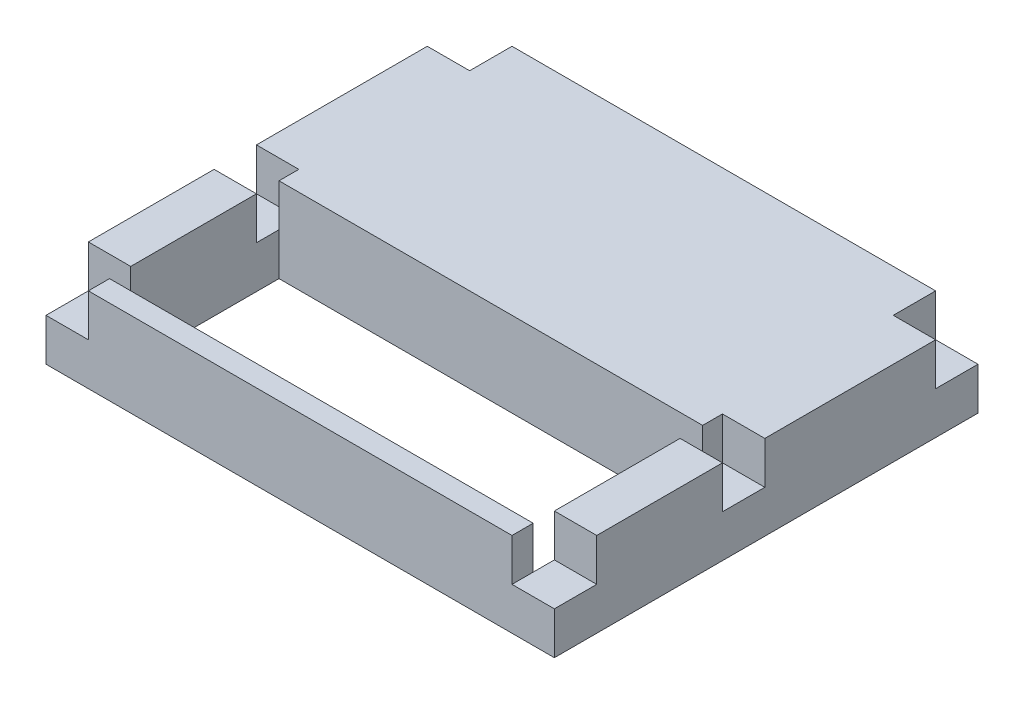
ISO-10303-21;
HEADER;
FILE_DESCRIPTION(('STEP AP214'),'2;1');
FILE_NAME('part.step','',(''),(''),'','','');
FILE_SCHEMA(('AUTOMOTIVE_DESIGN { 1 0 10303 214 1 1 1 1 }'));
ENDSEC;
DATA;
#1=APPLICATION_CONTEXT('core data for automotive mechanical design processes');
#2=APPLICATION_PROTOCOL_DEFINITION('international standard','automotive_design',2000,#1);
#3=PRODUCT_CONTEXT('',#1,'mechanical');
#4=PRODUCT('Part','Part','',(#3));
#5=PRODUCT_RELATED_PRODUCT_CATEGORY('part','',(#4));
#6=PRODUCT_DEFINITION_FORMATION('','',#4);
#7=PRODUCT_DEFINITION_CONTEXT('part definition',#1,'design');
#8=PRODUCT_DEFINITION('design','',#6,#7);
#9=PRODUCT_DEFINITION_SHAPE('','',#8);
#10=(LENGTH_UNIT() NAMED_UNIT(*) SI_UNIT(.MILLI.,.METRE.));
#11=(NAMED_UNIT(*) PLANE_ANGLE_UNIT() SI_UNIT($,.RADIAN.));
#12=(NAMED_UNIT(*) SI_UNIT($,.STERADIAN.) SOLID_ANGLE_UNIT());
#13=UNCERTAINTY_MEASURE_WITH_UNIT(LENGTH_MEASURE(1.E-05),#10,'distance_accuracy_value','');
#14=(GEOMETRIC_REPRESENTATION_CONTEXT(3) GLOBAL_UNCERTAINTY_ASSIGNED_CONTEXT((#13)) GLOBAL_UNIT_ASSIGNED_CONTEXT((#10,
#11,#12)) REPRESENTATION_CONTEXT('',''));
#15=CARTESIAN_POINT('',(0.,0.,0.));
#16=DIRECTION('',(0.,0.,1.));
#17=DIRECTION('',(1.,0.,0.));
#18=AXIS2_PLACEMENT_3D('',#15,#16,#17);
#19=CARTESIAN_POINT('',(0.,20.,0.));
#20=DIRECTION('',(0.,1.,0.));
#21=DIRECTION('',(0.,0.,1.));
#22=AXIS2_PLACEMENT_3D('',#19,#20,#21);
#23=PLANE('',#22);
#24=DIRECTION('',(-1.,0.,0.));
#25=VECTOR('',#24,1.);
#26=CARTESIAN_POINT('',(-60.,20.,40.));
#27=LINE('',#26,#25);
#28=CARTESIAN_POINT('',(-50.,20.,40.));
#29=VERTEX_POINT('',#28);
#30=CARTESIAN_POINT('',(-60.,20.,40.));
#31=VERTEX_POINT('',#30);
#32=EDGE_CURVE('E294',#29,#31,#27,.T.);
#33=ORIENTED_EDGE('',*,*,#32,.F.);
#34=DIRECTION('',(0.,0.,-1.));
#35=VECTOR('',#34,1.);
#36=CARTESIAN_POINT('',(-50.,20.,0.));
#37=LINE('',#36,#35);
#38=CARTESIAN_POINT('',(-50.,20.,10.3208888623795));
#39=VERTEX_POINT('',#38);
#40=EDGE_CURVE('E404',#29,#39,#37,.T.);
#41=ORIENTED_EDGE('',*,*,#40,.T.);
#42=DIRECTION('',(-1.,0.,0.));
#43=VECTOR('',#42,1.);
#44=CARTESIAN_POINT('',(0.,20.,10.3208888623795));
#45=LINE('',#44,#43);
#46=CARTESIAN_POINT('',(-60.,20.,10.3208888623795));
#47=VERTEX_POINT('',#46);
#48=EDGE_CURVE('E346',#39,#47,#45,.T.);
#49=ORIENTED_EDGE('',*,*,#48,.T.);
#50=DIRECTION('',(0.,0.,1.));
#51=VECTOR('',#50,1.);
#52=CARTESIAN_POINT('',(-60.,20.,-50.));
#53=LINE('',#52,#51);
#54=EDGE_CURVE('E432',#47,#31,#53,.T.);
#55=ORIENTED_EDGE('',*,*,#54,.T.);
#56=EDGE_LOOP('',(#33,#41,#49,#55));
#57=FACE_BOUND('',#56,.T.);
#58=ADVANCED_FACE('F39',(#57),#23,.T.);
#59=DIRECTION('',(0.,0.,-1.));
#60=VECTOR('',#59,1.);
#61=CARTESIAN_POINT('',(-50.,20.,40.));
#62=LINE('',#61,#60);
#63=CARTESIAN_POINT('',(-50.,20.,50.));
#64=VERTEX_POINT('',#63);
#65=CARTESIAN_POINT('',(-50.,20.,45.));
#66=VERTEX_POINT('',#65);
#67=EDGE_CURVE('E304',#64,#66,#62,.T.);
#68=ORIENTED_EDGE('',*,*,#67,.F.);
#69=DIRECTION('',(1.,0.,0.));
#70=VECTOR('',#69,1.);
#71=CARTESIAN_POINT('',(-60.,20.,50.));
#72=LINE('',#71,#70);
#73=CARTESIAN_POINT('',(50.,20.,50.));
#74=VERTEX_POINT('',#73);
#75=EDGE_CURVE('E435',#64,#74,#72,.T.);
#76=ORIENTED_EDGE('',*,*,#75,.T.);
#77=DIRECTION('',(0.,0.,1.));
#78=VECTOR('',#77,1.);
#79=CARTESIAN_POINT('',(50.,20.,50.));
#80=LINE('',#79,#78);
#81=CARTESIAN_POINT('',(50.,20.,45.));
#82=VERTEX_POINT('',#81);
#83=EDGE_CURVE('E269',#82,#74,#80,.T.);
#84=ORIENTED_EDGE('',*,*,#83,.F.);
#85=DIRECTION('',(1.,0.,0.));
#86=VECTOR('',#85,1.);
#87=CARTESIAN_POINT('',(-55.,20.,45.));
#88=LINE('',#87,#86);
#89=EDGE_CURVE('E416',#66,#82,#88,.T.);
#90=ORIENTED_EDGE('',*,*,#89,.F.);
#91=EDGE_LOOP('',(#68,#76,#84,#90));
#92=FACE_BOUND('',#91,.T.);
#93=ADVANCED_FACE('F504',(#92),#23,.T.);
#94=DIRECTION('',(-1.,0.,0.));
#95=VECTOR('',#94,1.);
#96=CARTESIAN_POINT('',(50.,20.,40.));
#97=LINE('',#96,#95);
#98=CARTESIAN_POINT('',(60.,20.,40.));
#99=VERTEX_POINT('',#98);
#100=CARTESIAN_POINT('',(50.,20.,40.));
#101=VERTEX_POINT('',#100);
#102=EDGE_CURVE('E278',#99,#101,#97,.T.);
#103=ORIENTED_EDGE('',*,*,#102,.F.);
#104=DIRECTION('',(0.,0.,-1.));
#105=VECTOR('',#104,1.);
#106=CARTESIAN_POINT('',(60.,20.,-50.));
#107=LINE('',#106,#105);
#108=CARTESIAN_POINT('',(60.,20.,10.3208888623795));
#109=VERTEX_POINT('',#108);
#110=EDGE_CURVE('E428',#99,#109,#107,.T.);
#111=ORIENTED_EDGE('',*,*,#110,.T.);
#112=DIRECTION('',(1.,0.,0.));
#113=VECTOR('',#112,1.);
#114=CARTESIAN_POINT('',(0.,20.,10.3208888623795));
#115=LINE('',#114,#113);
#116=CARTESIAN_POINT('',(50.,20.,10.3208888623795));
#117=VERTEX_POINT('',#116);
#118=EDGE_CURVE('E378',#117,#109,#115,.T.);
#119=ORIENTED_EDGE('',*,*,#118,.F.);
#120=DIRECTION('',(0.,0.,-1.));
#121=VECTOR('',#120,1.);
#122=CARTESIAN_POINT('',(50.,20.,0.));
#123=LINE('',#122,#121);
#124=EDGE_CURVE('E391',#101,#117,#123,.T.);
#125=ORIENTED_EDGE('',*,*,#124,.F.);
#126=EDGE_LOOP('',(#103,#111,#119,#125));
#127=FACE_BOUND('',#126,.T.);
#128=ADVANCED_FACE('F510',(#127),#23,.T.);
#129=CARTESIAN_POINT('',(60.,20.,-50.));
#130=DIRECTION('',(-1.,0.,0.));
#131=DIRECTION('',(0.,0.,1.));
#132=AXIS2_PLACEMENT_3D('',#129,#130,#131);
#133=PLANE('',#132);
#134=ORIENTED_EDGE('',*,*,#110,.F.);
#135=DIRECTION('',(0.,1.,0.));
#136=VECTOR('',#135,1.);
#137=CARTESIAN_POINT('',(60.,10.,40.));
#138=LINE('',#137,#136);
#139=CARTESIAN_POINT('',(60.,10.,40.));
#140=VERTEX_POINT('',#139);
#141=EDGE_CURVE('E277',#140,#99,#138,.T.);
#142=ORIENTED_EDGE('',*,*,#141,.F.);
#143=DIRECTION('',(0.,0.,-1.));
#144=VECTOR('',#143,1.);
#145=CARTESIAN_POINT('',(60.,10.,40.));
#146=LINE('',#145,#144);
#147=CARTESIAN_POINT('',(60.,10.,50.));
#148=VERTEX_POINT('',#147);
#149=EDGE_CURVE('E265',#148,#140,#146,.T.);
#150=ORIENTED_EDGE('',*,*,#149,.F.);
#151=DIRECTION('',(0.,-1.,0.));
#152=VECTOR('',#151,1.);
#153=CARTESIAN_POINT('',(60.,20.,50.));
#154=LINE('',#153,#152);
#155=CARTESIAN_POINT('',(60.,0.,50.));
#156=VERTEX_POINT('',#155);
#157=EDGE_CURVE('E438',#148,#156,#154,.T.);
#158=ORIENTED_EDGE('',*,*,#157,.T.);
#159=DIRECTION('',(0.,0.,-1.));
#160=VECTOR('',#159,1.);
#161=CARTESIAN_POINT('',(60.,0.,-50.));
#162=LINE('',#161,#160);
#163=CARTESIAN_POINT('',(60.,0.,-50.));
#164=VERTEX_POINT('',#163);
#165=EDGE_CURVE('E423',#156,#164,#162,.T.);
#166=ORIENTED_EDGE('',*,*,#165,.T.);
#167=DIRECTION('',(0.,-1.,0.));
#168=VECTOR('',#167,1.);
#169=CARTESIAN_POINT('',(60.,20.,-50.));
#170=LINE('',#169,#168);
#171=CARTESIAN_POINT('',(60.,10.,-50.));
#172=VERTEX_POINT('',#171);
#173=EDGE_CURVE('E47',#172,#164,#170,.T.);
#174=ORIENTED_EDGE('',*,*,#173,.F.);
#175=DIRECTION('',(0.,0.,-1.));
#176=VECTOR('',#175,1.);
#177=CARTESIAN_POINT('',(60.,10.,-50.));
#178=LINE('',#177,#176);
#179=CARTESIAN_POINT('',(60.,10.,-40.));
#180=VERTEX_POINT('',#179);
#181=EDGE_CURVE('E62',#180,#172,#178,.T.);
#182=ORIENTED_EDGE('',*,*,#181,.F.);
#183=DIRECTION('',(0.,1.,0.));
#184=VECTOR('',#183,1.);
#185=CARTESIAN_POINT('',(60.,10.,-40.));
#186=LINE('',#185,#184);
#187=CARTESIAN_POINT('',(60.,20.,-40.));
#188=VERTEX_POINT('',#187);
#189=EDGE_CURVE('E260',#180,#188,#186,.T.);
#190=ORIENTED_EDGE('',*,*,#189,.T.);
#191=CARTESIAN_POINT('',(60.,20.,0.320888862379548));
#192=VERTEX_POINT('',#191);
#193=EDGE_CURVE('E430',#192,#188,#107,.T.);
#194=ORIENTED_EDGE('',*,*,#193,.F.);
#195=DIRECTION('',(0.,1.,0.));
#196=VECTOR('',#195,1.);
#197=CARTESIAN_POINT('',(60.,10.,0.320888862379548));
#198=LINE('',#197,#196);
#199=CARTESIAN_POINT('',(60.,10.,0.320888862379548));
#200=VERTEX_POINT('',#199);
#201=EDGE_CURVE('E384',#200,#192,#198,.T.);
#202=ORIENTED_EDGE('',*,*,#201,.F.);
#203=DIRECTION('',(0.,0.,-1.));
#204=VECTOR('',#203,1.);
#205=CARTESIAN_POINT('',(60.,10.,0.));
#206=LINE('',#205,#204);
#207=CARTESIAN_POINT('',(60.,10.,10.3208888623795));
#208=VERTEX_POINT('',#207);
#209=EDGE_CURVE('E371',#208,#200,#206,.T.);
#210=ORIENTED_EDGE('',*,*,#209,.F.);
#211=DIRECTION('',(0.,1.,0.));
#212=VECTOR('',#211,1.);
#213=CARTESIAN_POINT('',(60.,10.,10.3208888623795));
#214=LINE('',#213,#212);
#215=EDGE_CURVE('E386',#208,#109,#214,.T.);
#216=ORIENTED_EDGE('',*,*,#215,.T.);
#217=EDGE_LOOP('',(#134,#142,#150,#158,#166,#174,#182,#190,#194,#202,#210,#216));
#218=FACE_BOUND('',#217,.T.);
#219=ADVANCED_FACE('F41',(#218),#133,.F.);
#220=CARTESIAN_POINT('',(-60.,20.,-50.));
#221=DIRECTION('',(1.,0.,0.));
#222=DIRECTION('',(0.,0.,-1.));
#223=AXIS2_PLACEMENT_3D('',#220,#221,#222);
#224=PLANE('',#223);
#225=DIRECTION('',(0.,0.,1.));
#226=VECTOR('',#225,1.);
#227=CARTESIAN_POINT('',(-60.,10.,50.));
#228=LINE('',#227,#226);
#229=CARTESIAN_POINT('',(-60.,10.,40.));
#230=VERTEX_POINT('',#229);
#231=CARTESIAN_POINT('',(-60.,10.,50.));
#232=VERTEX_POINT('',#231);
#233=EDGE_CURVE('E301',#230,#232,#228,.T.);
#234=ORIENTED_EDGE('',*,*,#233,.F.);
#235=DIRECTION('',(0.,1.,0.));
#236=VECTOR('',#235,1.);
#237=CARTESIAN_POINT('',(-60.,10.,40.));
#238=LINE('',#237,#236);
#239=EDGE_CURVE('E280',#230,#31,#238,.T.);
#240=ORIENTED_EDGE('',*,*,#239,.T.);
#241=ORIENTED_EDGE('',*,*,#54,.F.);
#242=DIRECTION('',(0.,1.,0.));
#243=VECTOR('',#242,1.);
#244=CARTESIAN_POINT('',(-60.,10.,10.3208888623795));
#245=LINE('',#244,#243);
#246=CARTESIAN_POINT('',(-60.,10.,10.3208888623795));
#247=VERTEX_POINT('',#246);
#248=EDGE_CURVE('E354',#247,#47,#245,.T.);
#249=ORIENTED_EDGE('',*,*,#248,.F.);
#250=DIRECTION('',(0.,0.,1.));
#251=VECTOR('',#250,1.);
#252=CARTESIAN_POINT('',(-60.,10.,0.));
#253=LINE('',#252,#251);
#254=CARTESIAN_POINT('',(-60.,10.,0.320888862379548));
#255=VERTEX_POINT('',#254);
#256=EDGE_CURVE('E342',#255,#247,#253,.T.);
#257=ORIENTED_EDGE('',*,*,#256,.F.);
#258=DIRECTION('',(0.,1.,0.));
#259=VECTOR('',#258,1.);
#260=CARTESIAN_POINT('',(-60.,10.,0.320888862379548));
#261=LINE('',#260,#259);
#262=CARTESIAN_POINT('',(-60.,20.,0.320888862379548));
#263=VERTEX_POINT('',#262);
#264=EDGE_CURVE('E357',#255,#263,#261,.T.);
#265=ORIENTED_EDGE('',*,*,#264,.T.);
#266=CARTESIAN_POINT('',(-60.,20.,-40.));
#267=VERTEX_POINT('',#266);
#268=EDGE_CURVE('E433',#267,#263,#53,.T.);
#269=ORIENTED_EDGE('',*,*,#268,.F.);
#270=DIRECTION('',(0.,1.,0.));
#271=VECTOR('',#270,1.);
#272=CARTESIAN_POINT('',(-60.,10.,-40.));
#273=LINE('',#272,#271);
#274=CARTESIAN_POINT('',(-60.,10.,-40.));
#275=VERTEX_POINT('',#274);
#276=EDGE_CURVE('E321',#275,#267,#273,.T.);
#277=ORIENTED_EDGE('',*,*,#276,.F.);
#278=DIRECTION('',(0.,0.,1.));
#279=VECTOR('',#278,1.);
#280=CARTESIAN_POINT('',(-60.,10.,-40.));
#281=LINE('',#280,#279);
#282=CARTESIAN_POINT('',(-60.,10.,-50.));
#283=VERTEX_POINT('',#282);
#284=EDGE_CURVE('E312',#283,#275,#281,.T.);
#285=ORIENTED_EDGE('',*,*,#284,.F.);
#286=DIRECTION('',(0.,-1.,0.));
#287=VECTOR('',#286,1.);
#288=CARTESIAN_POINT('',(-60.,20.,-50.));
#289=LINE('',#288,#287);
#290=CARTESIAN_POINT('',(-60.,0.,-50.));
#291=VERTEX_POINT('',#290);
#292=EDGE_CURVE('E453',#283,#291,#289,.T.);
#293=ORIENTED_EDGE('',*,*,#292,.T.);
#294=DIRECTION('',(0.,0.,1.));
#295=VECTOR('',#294,1.);
#296=CARTESIAN_POINT('',(-60.,0.,-50.));
#297=LINE('',#296,#295);
#298=CARTESIAN_POINT('',(-60.,0.,50.));
#299=VERTEX_POINT('',#298);
#300=EDGE_CURVE('E444',#291,#299,#297,.T.);
#301=ORIENTED_EDGE('',*,*,#300,.T.);
#302=DIRECTION('',(0.,-1.,0.));
#303=VECTOR('',#302,1.);
#304=CARTESIAN_POINT('',(-60.,20.,50.));
#305=LINE('',#304,#303);
#306=EDGE_CURVE('E451',#232,#299,#305,.T.);
#307=ORIENTED_EDGE('',*,*,#306,.F.);
#308=EDGE_LOOP('',(#234,#240,#241,#249,#257,#265,#269,#277,#285,#293,#301,#307));
#309=FACE_BOUND('',#308,.T.);
#310=ADVANCED_FACE('F475',(#309),#224,.F.);
#311=CARTESIAN_POINT('',(-50.,20.,0.));
#312=DIRECTION('',(-1.,0.,0.));
#313=DIRECTION('',(0.,0.,1.));
#314=AXIS2_PLACEMENT_3D('',#311,#312,#313);
#315=PLANE('',#314);
#316=ORIENTED_EDGE('',*,*,#40,.F.);
#317=DIRECTION('',(0.,1.,0.));
#318=VECTOR('',#317,1.);
#319=CARTESIAN_POINT('',(-50.,10.,40.));
#320=LINE('',#319,#318);
#321=CARTESIAN_POINT('',(-50.,10.,40.));
#322=VERTEX_POINT('',#321);
#323=EDGE_CURVE('E309',#322,#29,#320,.T.);
#324=ORIENTED_EDGE('',*,*,#323,.F.);
#325=DIRECTION('',(0.,0.,-1.));
#326=VECTOR('',#325,1.);
#327=CARTESIAN_POINT('',(-50.,10.,40.));
#328=LINE('',#327,#326);
#329=CARTESIAN_POINT('',(-50.,10.,45.));
#330=VERTEX_POINT('',#329);
#331=EDGE_CURVE('E293',#330,#322,#328,.T.);
#332=ORIENTED_EDGE('',*,*,#331,.F.);
#333=DIRECTION('',(0.,-1.,0.));
#334=VECTOR('',#333,1.);
#335=CARTESIAN_POINT('',(-50.,20.,45.));
#336=LINE('',#335,#334);
#337=CARTESIAN_POINT('',(-50.,0.,45.));
#338=VERTEX_POINT('',#337);
#339=EDGE_CURVE('E406',#330,#338,#336,.T.);
#340=ORIENTED_EDGE('',*,*,#339,.T.);
#341=DIRECTION('',(0.,0.,-1.));
#342=VECTOR('',#341,1.);
#343=CARTESIAN_POINT('',(-50.,0.,0.));
#344=LINE('',#343,#342);
#345=CARTESIAN_POINT('',(-50.,0.,4.99999999999999));
#346=VERTEX_POINT('',#345);
#347=EDGE_CURVE('E399',#338,#346,#344,.T.);
#348=ORIENTED_EDGE('',*,*,#347,.T.);
#349=DIRECTION('',(0.,-1.,0.));
#350=VECTOR('',#349,1.);
#351=CARTESIAN_POINT('',(-50.,20.,4.99999999999999));
#352=LINE('',#351,#350);
#353=CARTESIAN_POINT('',(-50.,10.,4.99999999999999));
#354=VERTEX_POINT('',#353);
#355=EDGE_CURVE('E413',#354,#346,#352,.T.);
#356=ORIENTED_EDGE('',*,*,#355,.F.);
#357=DIRECTION('',(0.,0.,-1.));
#358=VECTOR('',#357,1.);
#359=CARTESIAN_POINT('',(-50.,10.,0.));
#360=LINE('',#359,#358);
#361=CARTESIAN_POINT('',(-50.,10.,10.3208888623795));
#362=VERTEX_POINT('',#361);
#363=EDGE_CURVE('E336',#362,#354,#360,.T.);
#364=ORIENTED_EDGE('',*,*,#363,.F.);
#365=DIRECTION('',(0.,1.,0.));
#366=VECTOR('',#365,1.);
#367=CARTESIAN_POINT('',(-50.,10.,10.3208888623795));
#368=LINE('',#367,#366);
#369=EDGE_CURVE('E345',#362,#39,#368,.T.);
#370=ORIENTED_EDGE('',*,*,#369,.T.);
#371=EDGE_LOOP('',(#316,#324,#332,#340,#348,#356,#364,#370));
#372=FACE_BOUND('',#371,.T.);
#373=ADVANCED_FACE('F557',(#372),#315,.F.);
#374=CARTESIAN_POINT('',(-55.,20.,45.));
#375=DIRECTION('',(0.,0.,-1.));
#376=DIRECTION('',(-1.,0.,0.));
#377=AXIS2_PLACEMENT_3D('',#374,#375,#376);
#378=PLANE('',#377);
#379=DIRECTION('',(0.,-1.,0.));
#380=VECTOR('',#379,1.);
#381=CARTESIAN_POINT('',(50.,20.,45.));
#382=LINE('',#381,#380);
#383=CARTESIAN_POINT('',(50.,10.,45.));
#384=VERTEX_POINT('',#383);
#385=EDGE_CURVE('E401',#82,#384,#382,.T.);
#386=ORIENTED_EDGE('',*,*,#385,.T.);
#387=CARTESIAN_POINT('',(50.,0.,45.));
#388=VERTEX_POINT('',#387);
#389=EDGE_CURVE('E393',#384,#388,#382,.T.);
#390=ORIENTED_EDGE('',*,*,#389,.T.);
#391=DIRECTION('',(1.,0.,0.));
#392=VECTOR('',#391,1.);
#393=CARTESIAN_POINT('',(-55.,0.,45.));
#394=LINE('',#393,#392);
#395=EDGE_CURVE('E412',#338,#388,#394,.T.);
#396=ORIENTED_EDGE('',*,*,#395,.F.);
#397=ORIENTED_EDGE('',*,*,#339,.F.);
#398=EDGE_CURVE('E414',#66,#330,#336,.T.);
#399=ORIENTED_EDGE('',*,*,#398,.F.);
#400=ORIENTED_EDGE('',*,*,#89,.T.);
#401=EDGE_LOOP('',(#386,#390,#396,#397,#399,#400));
#402=FACE_BOUND('',#401,.T.);
#403=ADVANCED_FACE('F522',(#402),#378,.T.);
#404=CARTESIAN_POINT('',(55.,20.,5.));
#405=DIRECTION('',(0.,0.,1.));
#406=DIRECTION('',(1.,0.,0.));
#407=AXIS2_PLACEMENT_3D('',#404,#405,#406);
#408=PLANE('',#407);
#409=DIRECTION('',(0.,-1.,0.));
#410=VECTOR('',#409,1.);
#411=CARTESIAN_POINT('',(50.,20.,5.));
#412=LINE('',#411,#410);
#413=CARTESIAN_POINT('',(50.,20.,5.));
#414=VERTEX_POINT('',#413);
#415=CARTESIAN_POINT('',(50.,10.,5.));
#416=VERTEX_POINT('',#415);
#417=EDGE_CURVE('E396',#414,#416,#412,.T.);
#418=ORIENTED_EDGE('',*,*,#417,.F.);
#419=DIRECTION('',(-1.,0.,0.));
#420=VECTOR('',#419,1.);
#421=CARTESIAN_POINT('',(55.,20.,5.));
#422=LINE('',#421,#420);
#423=CARTESIAN_POINT('',(-50.,20.,4.99999999999999));
#424=VERTEX_POINT('',#423);
#425=EDGE_CURVE('E419',#414,#424,#422,.T.);
#426=ORIENTED_EDGE('',*,*,#425,.T.);
#427=EDGE_CURVE('E409',#424,#354,#352,.T.);
#428=ORIENTED_EDGE('',*,*,#427,.T.);
#429=ORIENTED_EDGE('',*,*,#355,.T.);
#430=DIRECTION('',(-1.,0.,0.));
#431=VECTOR('',#430,1.);
#432=CARTESIAN_POINT('',(55.,0.,5.));
#433=LINE('',#432,#431);
#434=CARTESIAN_POINT('',(50.,0.,5.));
#435=VERTEX_POINT('',#434);
#436=EDGE_CURVE('E420',#435,#346,#433,.T.);
#437=ORIENTED_EDGE('',*,*,#436,.F.);
#438=EDGE_CURVE('E400',#416,#435,#412,.T.);
#439=ORIENTED_EDGE('',*,*,#438,.F.);
#440=EDGE_LOOP('',(#418,#426,#428,#429,#437,#439));
#441=FACE_BOUND('',#440,.T.);
#442=ADVANCED_FACE('F516',(#441),#408,.T.);
#443=DIRECTION('',(1.,0.,0.));
#444=VECTOR('',#443,1.);
#445=CARTESIAN_POINT('',(60.,20.,-40.));
#446=LINE('',#445,#444);
#447=CARTESIAN_POINT('',(50.,20.,-40.));
#448=VERTEX_POINT('',#447);
#449=EDGE_CURVE('E252',#448,#188,#446,.T.);
#450=ORIENTED_EDGE('',*,*,#449,.F.);
#451=DIRECTION('',(0.,0.,1.));
#452=VECTOR('',#451,1.);
#453=CARTESIAN_POINT('',(50.,20.,-40.));
#454=LINE('',#453,#452);
#455=CARTESIAN_POINT('',(50.,20.,-50.));
#456=VERTEX_POINT('',#455);
#457=EDGE_CURVE('E285',#456,#448,#454,.T.);
#458=ORIENTED_EDGE('',*,*,#457,.F.);
#459=DIRECTION('',(-1.,0.,0.));
#460=VECTOR('',#459,1.);
#461=CARTESIAN_POINT('',(-60.,20.,-50.));
#462=LINE('',#461,#460);
#463=CARTESIAN_POINT('',(-50.,20.,-50.));
#464=VERTEX_POINT('',#463);
#465=EDGE_CURVE('E258',#456,#464,#462,.T.);
#466=ORIENTED_EDGE('',*,*,#465,.T.);
#467=DIRECTION('',(0.,0.,-1.));
#468=VECTOR('',#467,1.);
#469=CARTESIAN_POINT('',(-50.,20.,-50.));
#470=LINE('',#469,#468);
#471=CARTESIAN_POINT('',(-50.,20.,-40.));
#472=VERTEX_POINT('',#471);
#473=EDGE_CURVE('E316',#472,#464,#470,.T.);
#474=ORIENTED_EDGE('',*,*,#473,.F.);
#475=DIRECTION('',(1.,0.,0.));
#476=VECTOR('',#475,1.);
#477=CARTESIAN_POINT('',(-50.,20.,-40.));
#478=LINE('',#477,#476);
#479=EDGE_CURVE('E322',#267,#472,#478,.T.);
#480=ORIENTED_EDGE('',*,*,#479,.F.);
#481=ORIENTED_EDGE('',*,*,#268,.T.);
#482=DIRECTION('',(-1.,0.,0.));
#483=VECTOR('',#482,1.);
#484=CARTESIAN_POINT('',(0.,20.,0.320888862379548));
#485=LINE('',#484,#483);
#486=CARTESIAN_POINT('',(-50.,20.,0.320888862379548));
#487=VERTEX_POINT('',#486);
#488=EDGE_CURVE('E335',#487,#263,#485,.T.);
#489=ORIENTED_EDGE('',*,*,#488,.F.);
#490=DIRECTION('',(0.,0.,-1.));
#491=VECTOR('',#490,1.);
#492=CARTESIAN_POINT('',(-50.,20.,0.));
#493=LINE('',#492,#491);
#494=EDGE_CURVE('E349',#424,#487,#493,.T.);
#495=ORIENTED_EDGE('',*,*,#494,.F.);
#496=ORIENTED_EDGE('',*,*,#425,.F.);
#497=DIRECTION('',(0.,0.,1.));
#498=VECTOR('',#497,1.);
#499=CARTESIAN_POINT('',(50.,20.,0.));
#500=LINE('',#499,#498);
#501=CARTESIAN_POINT('',(50.,20.,0.320888862379548));
#502=VERTEX_POINT('',#501);
#503=EDGE_CURVE('E328',#502,#414,#500,.T.);
#504=ORIENTED_EDGE('',*,*,#503,.F.);
#505=DIRECTION('',(1.,0.,0.));
#506=VECTOR('',#505,1.);
#507=CARTESIAN_POINT('',(0.,20.,0.320888862379548));
#508=LINE('',#507,#506);
#509=EDGE_CURVE('E368',#502,#192,#508,.T.);
#510=ORIENTED_EDGE('',*,*,#509,.T.);
#511=ORIENTED_EDGE('',*,*,#193,.T.);
#512=EDGE_LOOP('',(#450,#458,#466,#474,#480,#481,#489,#495,#496,#504,#510,#511));
#513=FACE_BOUND('',#512,.T.);
#514=ADVANCED_FACE('F487',(#513),#23,.T.);
#515=CARTESIAN_POINT('',(0.,0.,0.));
#516=DIRECTION('',(0.,1.,0.));
#517=DIRECTION('',(0.,0.,1.));
#518=AXIS2_PLACEMENT_3D('',#515,#516,#517);
#519=PLANE('',#518);
#520=DIRECTION('',(0.,0.,-1.));
#521=VECTOR('',#520,1.);
#522=CARTESIAN_POINT('',(50.,0.,0.));
#523=LINE('',#522,#521);
#524=EDGE_CURVE('E356',#388,#435,#523,.T.);
#525=ORIENTED_EDGE('',*,*,#524,.T.);
#526=ORIENTED_EDGE('',*,*,#436,.T.);
#527=ORIENTED_EDGE('',*,*,#347,.F.);
#528=ORIENTED_EDGE('',*,*,#395,.T.);
#529=EDGE_LOOP('',(#525,#526,#527,#528));
#530=FACE_BOUND('',#529,.T.);
#531=ORIENTED_EDGE('',*,*,#165,.F.);
#532=DIRECTION('',(1.,0.,0.));
#533=VECTOR('',#532,1.);
#534=CARTESIAN_POINT('',(-60.,0.,50.));
#535=LINE('',#534,#533);
#536=EDGE_CURVE('E447',#299,#156,#535,.T.);
#537=ORIENTED_EDGE('',*,*,#536,.F.);
#538=ORIENTED_EDGE('',*,*,#300,.F.);
#539=DIRECTION('',(-1.,0.,0.));
#540=VECTOR('',#539,1.);
#541=CARTESIAN_POINT('',(-60.,0.,-50.));
#542=LINE('',#541,#540);
#543=EDGE_CURVE('E441',#164,#291,#542,.T.);
#544=ORIENTED_EDGE('',*,*,#543,.F.);
#545=EDGE_LOOP('',(#531,#537,#538,#544));
#546=FACE_BOUND('',#545,.T.);
#547=ADVANCED_FACE('F460',(#530,#546),#519,.F.);
#548=CARTESIAN_POINT('',(-60.,20.,-50.));
#549=DIRECTION('',(0.,0.,1.));
#550=DIRECTION('',(1.,0.,0.));
#551=AXIS2_PLACEMENT_3D('',#548,#549,#550);
#552=PLANE('',#551);
#553=ORIENTED_EDGE('',*,*,#465,.F.);
#554=DIRECTION('',(0.,1.,0.));
#555=VECTOR('',#554,1.);
#556=CARTESIAN_POINT('',(50.,10.,-50.));
#557=LINE('',#556,#555);
#558=CARTESIAN_POINT('',(50.,10.,-50.));
#559=VERTEX_POINT('',#558);
#560=EDGE_CURVE('E242',#559,#456,#557,.T.);
#561=ORIENTED_EDGE('',*,*,#560,.F.);
#562=DIRECTION('',(-1.,0.,0.));
#563=VECTOR('',#562,1.);
#564=CARTESIAN_POINT('',(50.,10.,-50.));
#565=LINE('',#564,#563);
#566=EDGE_CURVE('E247',#172,#559,#565,.T.);
#567=ORIENTED_EDGE('',*,*,#566,.F.);
#568=ORIENTED_EDGE('',*,*,#173,.T.);
#569=ORIENTED_EDGE('',*,*,#543,.T.);
#570=ORIENTED_EDGE('',*,*,#292,.F.);
#571=DIRECTION('',(-1.,0.,0.));
#572=VECTOR('',#571,1.);
#573=CARTESIAN_POINT('',(-60.,10.,-50.));
#574=LINE('',#573,#572);
#575=CARTESIAN_POINT('',(-50.,10.,-50.));
#576=VERTEX_POINT('',#575);
#577=EDGE_CURVE('E319',#576,#283,#574,.T.);
#578=ORIENTED_EDGE('',*,*,#577,.F.);
#579=DIRECTION('',(0.,1.,0.));
#580=VECTOR('',#579,1.);
#581=CARTESIAN_POINT('',(-50.,10.,-50.));
#582=LINE('',#581,#580);
#583=EDGE_CURVE('E326',#576,#464,#582,.T.);
#584=ORIENTED_EDGE('',*,*,#583,.T.);
#585=EDGE_LOOP('',(#553,#561,#567,#568,#569,#570,#578,#584));
#586=FACE_BOUND('',#585,.T.);
#587=ADVANCED_FACE('F255',(#586),#552,.F.);
#588=CARTESIAN_POINT('',(-60.,20.,50.));
#589=DIRECTION('',(0.,0.,-1.));
#590=DIRECTION('',(-1.,0.,0.));
#591=AXIS2_PLACEMENT_3D('',#588,#589,#590);
#592=PLANE('',#591);
#593=ORIENTED_EDGE('',*,*,#75,.F.);
#594=DIRECTION('',(0.,1.,0.));
#595=VECTOR('',#594,1.);
#596=CARTESIAN_POINT('',(-50.,10.,50.));
#597=LINE('',#596,#595);
#598=CARTESIAN_POINT('',(-50.,10.,50.));
#599=VERTEX_POINT('',#598);
#600=EDGE_CURVE('E303',#599,#64,#597,.T.);
#601=ORIENTED_EDGE('',*,*,#600,.F.);
#602=DIRECTION('',(1.,0.,0.));
#603=VECTOR('',#602,1.);
#604=CARTESIAN_POINT('',(-50.,10.,50.));
#605=LINE('',#604,#603);
#606=EDGE_CURVE('E290',#232,#599,#605,.T.);
#607=ORIENTED_EDGE('',*,*,#606,.F.);
#608=ORIENTED_EDGE('',*,*,#306,.T.);
#609=ORIENTED_EDGE('',*,*,#536,.T.);
#610=ORIENTED_EDGE('',*,*,#157,.F.);
#611=DIRECTION('',(1.,0.,0.));
#612=VECTOR('',#611,1.);
#613=CARTESIAN_POINT('',(60.,10.,50.));
#614=LINE('',#613,#612);
#615=CARTESIAN_POINT('',(50.,10.,50.));
#616=VERTEX_POINT('',#615);
#617=EDGE_CURVE('E275',#616,#148,#614,.T.);
#618=ORIENTED_EDGE('',*,*,#617,.F.);
#619=DIRECTION('',(0.,1.,0.));
#620=VECTOR('',#619,1.);
#621=CARTESIAN_POINT('',(50.,10.,50.));
#622=LINE('',#621,#620);
#623=EDGE_CURVE('E282',#616,#74,#622,.T.);
#624=ORIENTED_EDGE('',*,*,#623,.T.);
#625=EDGE_LOOP('',(#593,#601,#607,#608,#609,#610,#618,#624));
#626=FACE_BOUND('',#625,.T.);
#627=ADVANCED_FACE('F469',(#626),#592,.F.);
#628=CARTESIAN_POINT('',(50.,20.,0.));
#629=DIRECTION('',(-1.,0.,0.));
#630=DIRECTION('',(0.,0.,1.));
#631=AXIS2_PLACEMENT_3D('',#628,#629,#630);
#632=PLANE('',#631);
#633=DIRECTION('',(0.,1.,0.));
#634=VECTOR('',#633,1.);
#635=CARTESIAN_POINT('',(50.,10.,40.));
#636=LINE('',#635,#634);
#637=CARTESIAN_POINT('',(50.,10.,40.));
#638=VERTEX_POINT('',#637);
#639=EDGE_CURVE('E286',#638,#101,#636,.T.);
#640=ORIENTED_EDGE('',*,*,#639,.T.);
#641=ORIENTED_EDGE('',*,*,#124,.T.);
#642=DIRECTION('',(0.,1.,0.));
#643=VECTOR('',#642,1.);
#644=CARTESIAN_POINT('',(50.,10.,10.3208888623795));
#645=LINE('',#644,#643);
#646=CARTESIAN_POINT('',(50.,10.,10.3208888623795));
#647=VERTEX_POINT('',#646);
#648=EDGE_CURVE('E376',#647,#117,#645,.T.);
#649=ORIENTED_EDGE('',*,*,#648,.F.);
#650=DIRECTION('',(0.,0.,-1.));
#651=VECTOR('',#650,1.);
#652=CARTESIAN_POINT('',(50.,10.,0.));
#653=LINE('',#652,#651);
#654=EDGE_CURVE('E11',#647,#416,#653,.T.);
#655=ORIENTED_EDGE('',*,*,#654,.T.);
#656=ORIENTED_EDGE('',*,*,#438,.T.);
#657=ORIENTED_EDGE('',*,*,#524,.F.);
#658=ORIENTED_EDGE('',*,*,#389,.F.);
#659=DIRECTION('',(0.,0.,1.));
#660=VECTOR('',#659,1.);
#661=CARTESIAN_POINT('',(50.,10.,50.));
#662=LINE('',#661,#660);
#663=EDGE_CURVE('E272',#638,#384,#662,.T.);
#664=ORIENTED_EDGE('',*,*,#663,.F.);
#665=EDGE_LOOP('',(#640,#641,#649,#655,#656,#657,#658,#664));
#666=FACE_BOUND('',#665,.T.);
#667=ADVANCED_FACE('F547',(#666),#632,.T.);
#668=CARTESIAN_POINT('',(50.,10.,0.));
#669=DIRECTION('',(-1.,0.,0.));
#670=DIRECTION('',(0.,0.,1.));
#671=AXIS2_PLACEMENT_3D('',#668,#669,#670);
#672=PLANE('',#671);
#673=ORIENTED_EDGE('',*,*,#417,.T.);
#674=DIRECTION('',(0.,0.,1.));
#675=VECTOR('',#674,1.);
#676=CARTESIAN_POINT('',(50.,10.,0.));
#677=LINE('',#676,#675);
#678=CARTESIAN_POINT('',(50.,10.,0.320888862379548));
#679=VERTEX_POINT('',#678);
#680=EDGE_CURVE('E365',#679,#416,#677,.T.);
#681=ORIENTED_EDGE('',*,*,#680,.F.);
#682=DIRECTION('',(0.,1.,0.));
#683=VECTOR('',#682,1.);
#684=CARTESIAN_POINT('',(50.,10.,0.320888862379548));
#685=LINE('',#684,#683);
#686=EDGE_CURVE('E350',#679,#502,#685,.T.);
#687=ORIENTED_EDGE('',*,*,#686,.T.);
#688=ORIENTED_EDGE('',*,*,#503,.T.);
#689=EDGE_LOOP('',(#673,#681,#687,#688));
#690=FACE_BOUND('',#689,.T.);
#691=ADVANCED_FACE('F671',(#690),#672,.F.);
#692=CARTESIAN_POINT('',(0.,10.,0.320888862379548));
#693=DIRECTION('',(0.,0.,1.));
#694=DIRECTION('',(1.,0.,0.));
#695=AXIS2_PLACEMENT_3D('',#692,#693,#694);
#696=PLANE('',#695);
#697=ORIENTED_EDGE('',*,*,#509,.F.);
#698=ORIENTED_EDGE('',*,*,#686,.F.);
#699=DIRECTION('',(1.,0.,0.));
#700=VECTOR('',#699,1.);
#701=CARTESIAN_POINT('',(0.,10.,0.320888862379548));
#702=LINE('',#701,#700);
#703=EDGE_CURVE('E374',#679,#200,#702,.T.);
#704=ORIENTED_EDGE('',*,*,#703,.T.);
#705=ORIENTED_EDGE('',*,*,#201,.T.);
#706=EDGE_LOOP('',(#697,#698,#704,#705));
#707=FACE_BOUND('',#706,.T.);
#708=ADVANCED_FACE('F804',(#707),#696,.T.);
#709=CARTESIAN_POINT('',(0.,10.,10.3208888623795));
#710=DIRECTION('',(0.,0.,1.));
#711=DIRECTION('',(1.,0.,0.));
#712=AXIS2_PLACEMENT_3D('',#709,#710,#711);
#713=PLANE('',#712);
#714=ORIENTED_EDGE('',*,*,#118,.T.);
#715=ORIENTED_EDGE('',*,*,#215,.F.);
#716=DIRECTION('',(1.,0.,0.));
#717=VECTOR('',#716,1.);
#718=CARTESIAN_POINT('',(0.,10.,10.3208888623795));
#719=LINE('',#718,#717);
#720=EDGE_CURVE('E367',#647,#208,#719,.T.);
#721=ORIENTED_EDGE('',*,*,#720,.F.);
#722=ORIENTED_EDGE('',*,*,#648,.T.);
#723=EDGE_LOOP('',(#714,#715,#721,#722));
#724=FACE_BOUND('',#723,.T.);
#725=ADVANCED_FACE('F539',(#724),#713,.F.);
#726=CARTESIAN_POINT('',(0.,10.,0.));
#727=DIRECTION('',(0.,1.,0.));
#728=DIRECTION('',(0.,0.,1.));
#729=AXIS2_PLACEMENT_3D('',#726,#727,#728);
#730=PLANE('',#729);
#731=ORIENTED_EDGE('',*,*,#680,.T.);
#732=ORIENTED_EDGE('',*,*,#654,.F.);
#733=ORIENTED_EDGE('',*,*,#720,.T.);
#734=ORIENTED_EDGE('',*,*,#209,.T.);
#735=ORIENTED_EDGE('',*,*,#703,.F.);
#736=EDGE_LOOP('',(#731,#732,#733,#734,#735));
#737=FACE_BOUND('',#736,.T.);
#738=ADVANCED_FACE('F542',(#737),#730,.T.);
#739=CARTESIAN_POINT('',(0.,10.,10.3208888623795));
#740=DIRECTION('',(0.,0.,-1.));
#741=DIRECTION('',(-1.,0.,0.));
#742=AXIS2_PLACEMENT_3D('',#739,#740,#741);
#743=PLANE('',#742);
#744=ORIENTED_EDGE('',*,*,#48,.F.);
#745=ORIENTED_EDGE('',*,*,#369,.F.);
#746=DIRECTION('',(-1.,0.,0.));
#747=VECTOR('',#746,1.);
#748=CARTESIAN_POINT('',(0.,10.,10.3208888623795));
#749=LINE('',#748,#747);
#750=EDGE_CURVE('E332',#362,#247,#749,.T.);
#751=ORIENTED_EDGE('',*,*,#750,.T.);
#752=ORIENTED_EDGE('',*,*,#248,.T.);
#753=EDGE_LOOP('',(#744,#745,#751,#752));
#754=FACE_BOUND('',#753,.T.);
#755=ADVANCED_FACE('F775',(#754),#743,.T.);
#756=CARTESIAN_POINT('',(0.,10.,0.320888862379548));
#757=DIRECTION('',(0.,0.,-1.));
#758=DIRECTION('',(-1.,0.,0.));
#759=AXIS2_PLACEMENT_3D('',#756,#757,#758);
#760=PLANE('',#759);
#761=ORIENTED_EDGE('',*,*,#488,.T.);
#762=ORIENTED_EDGE('',*,*,#264,.F.);
#763=DIRECTION('',(-1.,0.,0.));
#764=VECTOR('',#763,1.);
#765=CARTESIAN_POINT('',(0.,10.,0.320888862379548));
#766=LINE('',#765,#764);
#767=CARTESIAN_POINT('',(-50.,10.,0.320888862379548));
#768=VERTEX_POINT('',#767);
#769=EDGE_CURVE('E339',#768,#255,#766,.T.);
#770=ORIENTED_EDGE('',*,*,#769,.F.);
#771=DIRECTION('',(0.,1.,0.));
#772=VECTOR('',#771,1.);
#773=CARTESIAN_POINT('',(-50.,10.,0.320888862379548));
#774=LINE('',#773,#772);
#775=EDGE_CURVE('E360',#768,#487,#774,.T.);
#776=ORIENTED_EDGE('',*,*,#775,.T.);
#777=EDGE_LOOP('',(#761,#762,#770,#776));
#778=FACE_BOUND('',#777,.T.);
#779=ADVANCED_FACE('F764',(#778),#760,.F.);
#780=CARTESIAN_POINT('',(-50.,10.,0.));
#781=DIRECTION('',(1.,0.,0.));
#782=DIRECTION('',(0.,0.,-1.));
#783=AXIS2_PLACEMENT_3D('',#780,#781,#782);
#784=PLANE('',#783);
#785=ORIENTED_EDGE('',*,*,#427,.F.);
#786=ORIENTED_EDGE('',*,*,#494,.T.);
#787=ORIENTED_EDGE('',*,*,#775,.F.);
#788=EDGE_CURVE('E334',#354,#768,#360,.T.);
#789=ORIENTED_EDGE('',*,*,#788,.F.);
#790=EDGE_LOOP('',(#785,#786,#787,#789));
#791=FACE_BOUND('',#790,.T.);
#792=ADVANCED_FACE('F752',(#791),#784,.F.);
#793=CARTESIAN_POINT('',(0.,10.,0.));
#794=DIRECTION('',(0.,1.,0.));
#795=DIRECTION('',(0.,0.,1.));
#796=AXIS2_PLACEMENT_3D('',#793,#794,#795);
#797=PLANE('',#796);
#798=ORIENTED_EDGE('',*,*,#750,.F.);
#799=ORIENTED_EDGE('',*,*,#363,.T.);
#800=ORIENTED_EDGE('',*,*,#788,.T.);
#801=ORIENTED_EDGE('',*,*,#769,.T.);
#802=ORIENTED_EDGE('',*,*,#256,.T.);
#803=EDGE_LOOP('',(#798,#799,#800,#801,#802));
#804=FACE_BOUND('',#803,.T.);
#805=ADVANCED_FACE('F580',(#804),#797,.T.);
#806=CARTESIAN_POINT('',(50.,10.,50.));
#807=DIRECTION('',(-1.,0.,0.));
#808=DIRECTION('',(0.,0.,1.));
#809=AXIS2_PLACEMENT_3D('',#806,#807,#808);
#810=PLANE('',#809);
#811=ORIENTED_EDGE('',*,*,#385,.F.);
#812=ORIENTED_EDGE('',*,*,#83,.T.);
#813=ORIENTED_EDGE('',*,*,#623,.F.);
#814=EDGE_CURVE('E271',#384,#616,#662,.T.);
#815=ORIENTED_EDGE('',*,*,#814,.F.);
#816=EDGE_LOOP('',(#811,#812,#813,#815));
#817=FACE_BOUND('',#816,.T.);
#818=ADVANCED_FACE('F572',(#817),#810,.F.);
#819=CARTESIAN_POINT('',(50.,10.,40.));
#820=DIRECTION('',(0.,0.,-1.));
#821=DIRECTION('',(-1.,0.,0.));
#822=AXIS2_PLACEMENT_3D('',#819,#820,#821);
#823=PLANE('',#822);
#824=ORIENTED_EDGE('',*,*,#102,.T.);
#825=ORIENTED_EDGE('',*,*,#639,.F.);
#826=DIRECTION('',(-1.,0.,0.));
#827=VECTOR('',#826,1.);
#828=CARTESIAN_POINT('',(50.,10.,40.));
#829=LINE('',#828,#827);
#830=EDGE_CURVE('E268',#140,#638,#829,.T.);
#831=ORIENTED_EDGE('',*,*,#830,.F.);
#832=ORIENTED_EDGE('',*,*,#141,.T.);
#833=EDGE_LOOP('',(#824,#825,#831,#832));
#834=FACE_BOUND('',#833,.T.);
#835=ADVANCED_FACE('F570',(#834),#823,.F.);
#836=CARTESIAN_POINT('',(0.,10.,0.));
#837=DIRECTION('',(0.,-1.,0.));
#838=DIRECTION('',(0.,0.,-1.));
#839=AXIS2_PLACEMENT_3D('',#836,#837,#838);
#840=PLANE('',#839);
#841=ORIENTED_EDGE('',*,*,#149,.T.);
#842=ORIENTED_EDGE('',*,*,#830,.T.);
#843=ORIENTED_EDGE('',*,*,#663,.T.);
#844=ORIENTED_EDGE('',*,*,#814,.T.);
#845=ORIENTED_EDGE('',*,*,#617,.T.);
#846=EDGE_LOOP('',(#841,#842,#843,#844,#845));
#847=FACE_BOUND('',#846,.T.);
#848=ADVANCED_FACE('F568',(#847),#840,.F.);
#849=CARTESIAN_POINT('',(-60.,10.,40.));
#850=DIRECTION('',(0.,0.,-1.));
#851=DIRECTION('',(-1.,0.,0.));
#852=AXIS2_PLACEMENT_3D('',#849,#850,#851);
#853=PLANE('',#852);
#854=ORIENTED_EDGE('',*,*,#32,.T.);
#855=ORIENTED_EDGE('',*,*,#239,.F.);
#856=DIRECTION('',(-1.,0.,0.));
#857=VECTOR('',#856,1.);
#858=CARTESIAN_POINT('',(-60.,10.,40.));
#859=LINE('',#858,#857);
#860=EDGE_CURVE('E298',#322,#230,#859,.T.);
#861=ORIENTED_EDGE('',*,*,#860,.F.);
#862=ORIENTED_EDGE('',*,*,#323,.T.);
#863=EDGE_LOOP('',(#854,#855,#861,#862));
#864=FACE_BOUND('',#863,.T.);
#865=ADVANCED_FACE('F578',(#864),#853,.F.);
#866=CARTESIAN_POINT('',(-50.,10.,40.));
#867=DIRECTION('',(1.,0.,0.));
#868=DIRECTION('',(0.,0.,-1.));
#869=AXIS2_PLACEMENT_3D('',#866,#867,#868);
#870=PLANE('',#869);
#871=ORIENTED_EDGE('',*,*,#398,.T.);
#872=EDGE_CURVE('E295',#599,#330,#328,.T.);
#873=ORIENTED_EDGE('',*,*,#872,.F.);
#874=ORIENTED_EDGE('',*,*,#600,.T.);
#875=ORIENTED_EDGE('',*,*,#67,.T.);
#876=EDGE_LOOP('',(#871,#873,#874,#875));
#877=FACE_BOUND('',#876,.T.);
#878=ADVANCED_FACE('F499',(#877),#870,.F.);
#879=CARTESIAN_POINT('',(0.,10.,0.));
#880=DIRECTION('',(0.,-1.,0.));
#881=DIRECTION('',(0.,0.,-1.));
#882=AXIS2_PLACEMENT_3D('',#879,#880,#881);
#883=PLANE('',#882);
#884=ORIENTED_EDGE('',*,*,#606,.T.);
#885=ORIENTED_EDGE('',*,*,#872,.T.);
#886=ORIENTED_EDGE('',*,*,#331,.T.);
#887=ORIENTED_EDGE('',*,*,#860,.T.);
#888=ORIENTED_EDGE('',*,*,#233,.T.);
#889=EDGE_LOOP('',(#884,#885,#886,#887,#888));
#890=FACE_BOUND('',#889,.T.);
#891=ADVANCED_FACE('F492',(#890),#883,.F.);
#892=CARTESIAN_POINT('',(-50.,10.,-50.));
#893=DIRECTION('',(1.,0.,0.));
#894=DIRECTION('',(0.,0.,-1.));
#895=AXIS2_PLACEMENT_3D('',#892,#893,#894);
#896=PLANE('',#895);
#897=ORIENTED_EDGE('',*,*,#473,.T.);
#898=ORIENTED_EDGE('',*,*,#583,.F.);
#899=DIRECTION('',(0.,0.,-1.));
#900=VECTOR('',#899,1.);
#901=CARTESIAN_POINT('',(-50.,10.,-50.));
#902=LINE('',#901,#900);
#903=CARTESIAN_POINT('',(-50.,10.,-40.));
#904=VERTEX_POINT('',#903);
#905=EDGE_CURVE('E54',#904,#576,#902,.T.);
#906=ORIENTED_EDGE('',*,*,#905,.F.);
#907=DIRECTION('',(0.,1.,0.));
#908=VECTOR('',#907,1.);
#909=CARTESIAN_POINT('',(-50.,10.,-40.));
#910=LINE('',#909,#908);
#911=EDGE_CURVE('E329',#904,#472,#910,.T.);
#912=ORIENTED_EDGE('',*,*,#911,.T.);
#913=EDGE_LOOP('',(#897,#898,#906,#912));
#914=FACE_BOUND('',#913,.T.);
#915=ADVANCED_FACE('F490',(#914),#896,.F.);
#916=CARTESIAN_POINT('',(-50.,10.,-40.));
#917=DIRECTION('',(0.,0.,1.));
#918=DIRECTION('',(1.,0.,0.));
#919=AXIS2_PLACEMENT_3D('',#916,#917,#918);
#920=PLANE('',#919);
#921=ORIENTED_EDGE('',*,*,#479,.T.);
#922=ORIENTED_EDGE('',*,*,#911,.F.);
#923=DIRECTION('',(1.,0.,0.));
#924=VECTOR('',#923,1.);
#925=CARTESIAN_POINT('',(-50.,10.,-40.));
#926=LINE('',#925,#924);
#927=EDGE_CURVE('E315',#275,#904,#926,.T.);
#928=ORIENTED_EDGE('',*,*,#927,.F.);
#929=ORIENTED_EDGE('',*,*,#276,.T.);
#930=EDGE_LOOP('',(#921,#922,#928,#929));
#931=FACE_BOUND('',#930,.T.);
#932=ADVANCED_FACE('F483',(#931),#920,.F.);
#933=CARTESIAN_POINT('',(0.,10.,0.));
#934=DIRECTION('',(0.,-1.,0.));
#935=DIRECTION('',(0.,0.,-1.));
#936=AXIS2_PLACEMENT_3D('',#933,#934,#935);
#937=PLANE('',#936);
#938=ORIENTED_EDGE('',*,*,#284,.T.);
#939=ORIENTED_EDGE('',*,*,#927,.T.);
#940=ORIENTED_EDGE('',*,*,#905,.T.);
#941=ORIENTED_EDGE('',*,*,#577,.T.);
#942=EDGE_LOOP('',(#938,#939,#940,#941));
#943=FACE_BOUND('',#942,.T.);
#944=ADVANCED_FACE('F479',(#943),#937,.F.);
#945=CARTESIAN_POINT('',(60.,10.,-40.));
#946=DIRECTION('',(0.,0.,1.));
#947=DIRECTION('',(1.,0.,0.));
#948=AXIS2_PLACEMENT_3D('',#945,#946,#947);
#949=PLANE('',#948);
#950=ORIENTED_EDGE('',*,*,#449,.T.);
#951=ORIENTED_EDGE('',*,*,#189,.F.);
#952=DIRECTION('',(1.,0.,0.));
#953=VECTOR('',#952,1.);
#954=CARTESIAN_POINT('',(60.,10.,-40.));
#955=LINE('',#954,#953);
#956=CARTESIAN_POINT('',(50.,10.,-40.));
#957=VERTEX_POINT('',#956);
#958=EDGE_CURVE('E246',#957,#180,#955,.T.);
#959=ORIENTED_EDGE('',*,*,#958,.F.);
#960=DIRECTION('',(0.,1.,0.));
#961=VECTOR('',#960,1.);
#962=CARTESIAN_POINT('',(50.,10.,-40.));
#963=LINE('',#962,#961);
#964=EDGE_CURVE('E244',#957,#448,#963,.T.);
#965=ORIENTED_EDGE('',*,*,#964,.T.);
#966=EDGE_LOOP('',(#950,#951,#959,#965));
#967=FACE_BOUND('',#966,.T.);
#968=ADVANCED_FACE('F590',(#967),#949,.F.);
#969=CARTESIAN_POINT('',(50.,10.,-40.));
#970=DIRECTION('',(-1.,0.,0.));
#971=DIRECTION('',(0.,0.,1.));
#972=AXIS2_PLACEMENT_3D('',#969,#970,#971);
#973=PLANE('',#972);
#974=ORIENTED_EDGE('',*,*,#457,.T.);
#975=ORIENTED_EDGE('',*,*,#964,.F.);
#976=DIRECTION('',(0.,0.,1.));
#977=VECTOR('',#976,1.);
#978=CARTESIAN_POINT('',(50.,10.,-40.));
#979=LINE('',#978,#977);
#980=EDGE_CURVE('E238',#559,#957,#979,.T.);
#981=ORIENTED_EDGE('',*,*,#980,.F.);
#982=ORIENTED_EDGE('',*,*,#560,.T.);
#983=EDGE_LOOP('',(#974,#975,#981,#982));
#984=FACE_BOUND('',#983,.T.);
#985=ADVANCED_FACE('F240',(#984),#973,.F.);
#986=CARTESIAN_POINT('',(0.,10.,0.));
#987=DIRECTION('',(0.,-1.,0.));
#988=DIRECTION('',(0.,0.,-1.));
#989=AXIS2_PLACEMENT_3D('',#986,#987,#988);
#990=PLANE('',#989);
#991=ORIENTED_EDGE('',*,*,#566,.T.);
#992=ORIENTED_EDGE('',*,*,#980,.T.);
#993=ORIENTED_EDGE('',*,*,#958,.T.);
#994=ORIENTED_EDGE('',*,*,#181,.T.);
#995=EDGE_LOOP('',(#991,#992,#993,#994));
#996=FACE_BOUND('',#995,.T.);
#997=ADVANCED_FACE('F249',(#996),#990,.F.);
#998=CLOSED_SHELL('',(#58,#93,#128,#219,#310,#373,#403,#442,#514,#547,#587,#627,#667,#691,#708,
#725,#738,#755,#779,#792,#805,#818,#835,#848,#865,#878,#891,#915,#932,#944,#968,#985,#997));
#999=MANIFOLD_SOLID_BREP('B2',#998);
#1000=ADVANCED_BREP_SHAPE_REPRESENTATION('',(#18,#999),#14);
#1001=SHAPE_DEFINITION_REPRESENTATION(#9,#1000);
ENDSEC;
END-ISO-10303-21;
